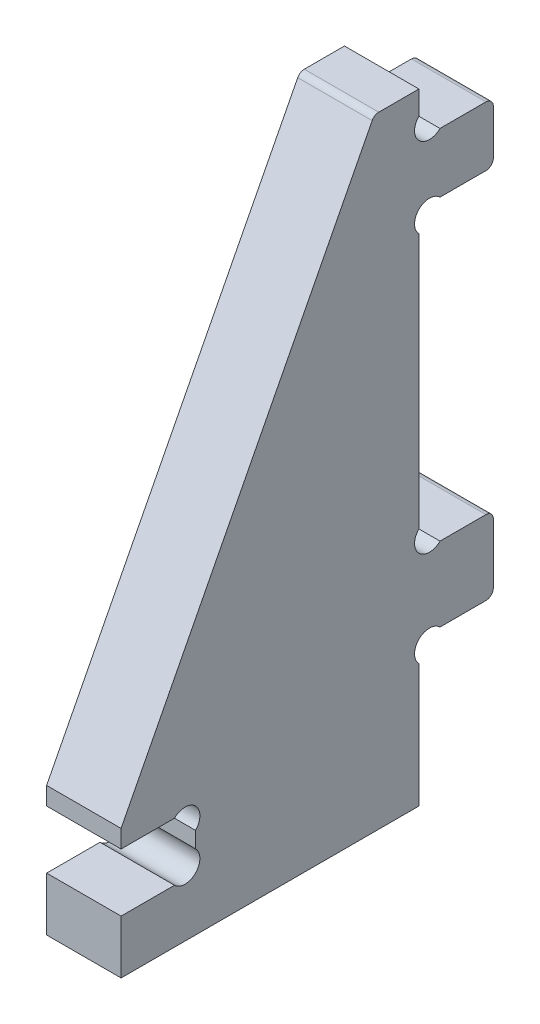
ISO-10303-21;
HEADER;
FILE_DESCRIPTION(('STEP AP214'),'2;1');
FILE_NAME('part.step','',(''),(''),'','','');
FILE_SCHEMA(('AUTOMOTIVE_DESIGN { 1 0 10303 214 1 1 1 1 }'));
ENDSEC;
DATA;
#1=APPLICATION_CONTEXT('core data for automotive mechanical design processes');
#2=APPLICATION_PROTOCOL_DEFINITION('international standard','automotive_design',2000,#1);
#3=PRODUCT_CONTEXT('',#1,'mechanical');
#4=PRODUCT('Part','Part','',(#3));
#5=PRODUCT_RELATED_PRODUCT_CATEGORY('part','',(#4));
#6=PRODUCT_DEFINITION_FORMATION('','',#4);
#7=PRODUCT_DEFINITION_CONTEXT('part definition',#1,'design');
#8=PRODUCT_DEFINITION('design','',#6,#7);
#9=PRODUCT_DEFINITION_SHAPE('','',#8);
#10=(LENGTH_UNIT() NAMED_UNIT(*) SI_UNIT(.MILLI.,.METRE.));
#11=(NAMED_UNIT(*) PLANE_ANGLE_UNIT() SI_UNIT($,.RADIAN.));
#12=(NAMED_UNIT(*) SI_UNIT($,.STERADIAN.) SOLID_ANGLE_UNIT());
#13=UNCERTAINTY_MEASURE_WITH_UNIT(LENGTH_MEASURE(1.E-05),#10,'distance_accuracy_value','');
#14=(GEOMETRIC_REPRESENTATION_CONTEXT(3) GLOBAL_UNCERTAINTY_ASSIGNED_CONTEXT((#13)) GLOBAL_UNIT_ASSIGNED_CONTEXT((#10,
#11,#12)) REPRESENTATION_CONTEXT('',''));
#15=CARTESIAN_POINT('',(0.,0.,0.));
#16=DIRECTION('',(0.,0.,1.));
#17=DIRECTION('',(1.,0.,0.));
#18=AXIS2_PLACEMENT_3D('',#15,#16,#17);
#19=CARTESIAN_POINT('',(5.,45.,-20.));
#20=DIRECTION('',(0.,0.,1.));
#21=DIRECTION('',(0.,-1.,0.));
#22=AXIS2_PLACEMENT_3D('',#19,#20,#21);
#23=PLANE('',#22);
#24=DIRECTION('',(0.,1.,0.));
#25=VECTOR('',#24,1.);
#26=CARTESIAN_POINT('',(0.,45.,-20.));
#27=LINE('',#26,#25);
#28=CARTESIAN_POINT('',(0.,19.4142135623731,-20.));
#29=VERTEX_POINT('',#28);
#30=CARTESIAN_POINT('',(0.,36.585786437627,-20.));
#31=VERTEX_POINT('',#30);
#32=EDGE_CURVE('E281',#29,#31,#27,.T.);
#33=ORIENTED_EDGE('',*,*,#32,.T.);
#34=DIRECTION('',(1.,0.,0.));
#35=VECTOR('',#34,1.);
#36=CARTESIAN_POINT('',(0.,36.585786437627,-20.));
#37=LINE('',#36,#35);
#38=CARTESIAN_POINT('',(5.,36.585786437627,-20.));
#39=VERTEX_POINT('',#38);
#40=EDGE_CURVE('E474',#31,#39,#37,.T.);
#41=ORIENTED_EDGE('',*,*,#40,.T.);
#42=DIRECTION('',(0.,1.,0.));
#43=VECTOR('',#42,1.);
#44=CARTESIAN_POINT('',(5.,45.,-20.));
#45=LINE('',#44,#43);
#46=CARTESIAN_POINT('',(5.,19.4142135623731,-20.));
#47=VERTEX_POINT('',#46);
#48=EDGE_CURVE('E245',#47,#39,#45,.T.);
#49=ORIENTED_EDGE('',*,*,#48,.F.);
#50=DIRECTION('',(1.,0.,0.));
#51=VECTOR('',#50,1.);
#52=CARTESIAN_POINT('',(0.,19.4142135623731,-20.));
#53=LINE('',#52,#51);
#54=EDGE_CURVE('E383',#47,#29,#53,.F.);
#55=ORIENTED_EDGE('',*,*,#54,.T.);
#56=EDGE_LOOP('',(#33,#41,#49,#55));
#57=FACE_BOUND('',#56,.T.);
#58=ADVANCED_FACE('F34',(#57),#23,.F.);
#59=CARTESIAN_POINT('',(5.,43.4142135623731,-20.));
#60=VERTEX_POINT('',#59);
#61=CARTESIAN_POINT('',(5.,45.,-20.));
#62=VERTEX_POINT('',#61);
#63=EDGE_CURVE('E236',#60,#62,#45,.T.);
#64=ORIENTED_EDGE('',*,*,#63,.F.);
#65=DIRECTION('',(1.,0.,0.));
#66=VECTOR('',#65,1.);
#67=CARTESIAN_POINT('',(0.,43.4142135623731,-20.));
#68=LINE('',#67,#66);
#69=CARTESIAN_POINT('',(0.,43.4142135623731,-20.));
#70=VERTEX_POINT('',#69);
#71=EDGE_CURVE('E221',#60,#70,#68,.F.);
#72=ORIENTED_EDGE('',*,*,#71,.T.);
#73=CARTESIAN_POINT('',(0.,45.,-20.));
#74=VERTEX_POINT('',#73);
#75=EDGE_CURVE('E257',#70,#74,#27,.T.);
#76=ORIENTED_EDGE('',*,*,#75,.T.);
#77=DIRECTION('',(-1.,0.,0.));
#78=VECTOR('',#77,1.);
#79=CARTESIAN_POINT('',(5.,45.,-20.));
#80=LINE('',#79,#78);
#81=EDGE_CURVE('E243',#62,#74,#80,.T.);
#82=ORIENTED_EDGE('',*,*,#81,.F.);
#83=EDGE_LOOP('',(#64,#72,#76,#82));
#84=FACE_BOUND('',#83,.T.);
#85=ADVANCED_FACE('F241',(#84),#23,.F.);
#86=CARTESIAN_POINT('',(0.,3.3,-20.));
#87=VERTEX_POINT('',#86);
#88=CARTESIAN_POINT('',(0.,11.5857864376269,-20.));
#89=VERTEX_POINT('',#88);
#90=EDGE_CURVE('E277',#87,#89,#27,.T.);
#91=ORIENTED_EDGE('',*,*,#90,.T.);
#92=DIRECTION('',(1.,0.,0.));
#93=VECTOR('',#92,1.);
#94=CARTESIAN_POINT('',(0.,11.5857864376269,-20.));
#95=LINE('',#94,#93);
#96=CARTESIAN_POINT('',(5.,11.5857864376269,-20.));
#97=VERTEX_POINT('',#96);
#98=EDGE_CURVE('E526',#89,#97,#95,.T.);
#99=ORIENTED_EDGE('',*,*,#98,.T.);
#100=CARTESIAN_POINT('',(5.,3.3,-20.));
#101=VERTEX_POINT('',#100);
#102=EDGE_CURVE('E249',#101,#97,#45,.T.);
#103=ORIENTED_EDGE('',*,*,#102,.F.);
#104=DIRECTION('',(1.,0.,0.));
#105=VECTOR('',#104,1.);
#106=CARTESIAN_POINT('',(0.,3.3,-20.));
#107=LINE('',#106,#105);
#108=EDGE_CURVE('E423',#87,#101,#107,.T.);
#109=ORIENTED_EDGE('',*,*,#108,.F.);
#110=EDGE_LOOP('',(#91,#99,#103,#109));
#111=FACE_BOUND('',#110,.T.);
#112=ADVANCED_FACE('F524',(#111),#23,.F.);
#113=CARTESIAN_POINT('',(5.,45.,-17.));
#114=DIRECTION('',(0.,-1.,0.));
#115=DIRECTION('',(0.,0.,-1.));
#116=AXIS2_PLACEMENT_3D('',#113,#114,#115);
#117=PLANE('',#116);
#118=DIRECTION('',(0.,0.,1.));
#119=VECTOR('',#118,1.);
#120=CARTESIAN_POINT('',(0.,45.,-17.));
#121=LINE('',#120,#119);
#122=CARTESIAN_POINT('',(0.,45.,-17.3048700361597));
#123=VERTEX_POINT('',#122);
#124=EDGE_CURVE('E280',#74,#123,#121,.T.);
#125=ORIENTED_EDGE('',*,*,#124,.T.);
#126=DIRECTION('',(-1.,0.,0.));
#127=VECTOR('',#126,1.);
#128=CARTESIAN_POINT('',(5.,45.,-17.3048700361597));
#129=LINE('',#128,#127);
#130=CARTESIAN_POINT('',(5.,45.,-17.3048700361597));
#131=VERTEX_POINT('',#130);
#132=EDGE_CURVE('E326',#123,#131,#129,.F.);
#133=ORIENTED_EDGE('',*,*,#132,.T.);
#134=DIRECTION('',(0.,0.,1.));
#135=VECTOR('',#134,1.);
#136=CARTESIAN_POINT('',(5.,45.,-17.));
#137=LINE('',#136,#135);
#138=EDGE_CURVE('E267',#62,#131,#137,.T.);
#139=ORIENTED_EDGE('',*,*,#138,.F.);
#140=ORIENTED_EDGE('',*,*,#81,.T.);
#141=EDGE_LOOP('',(#125,#133,#139,#140));
#142=FACE_BOUND('',#141,.T.);
#143=ADVANCED_FACE('F491',(#142),#117,.F.);
#144=CARTESIAN_POINT('',(5.,12.,0.));
#145=DIRECTION('',(0.,-0.45795658967431,-0.888974556426603));
#146=DIRECTION('',(0.,0.888974556426603,-0.45795658967431));
#147=AXIS2_PLACEMENT_3D('',#144,#145,#146);
#148=PLANE('',#147);
#149=DIRECTION('',(0.,-0.888974556426603,0.45795658967431));
#150=VECTOR('',#149,1.);
#151=CARTESIAN_POINT('',(5.,12.,0.));
#152=LINE('',#151,#150);
#153=CARTESIAN_POINT('',(5.,44.7289782948371,-16.8603827579464));
#154=VERTEX_POINT('',#153);
#155=CARTESIAN_POINT('',(5.,12.,0.));
#156=VERTEX_POINT('',#155);
#157=EDGE_CURVE('E446',#154,#156,#152,.T.);
#158=ORIENTED_EDGE('',*,*,#157,.F.);
#159=DIRECTION('',(-1.,0.,0.));
#160=VECTOR('',#159,1.);
#161=CARTESIAN_POINT('',(5.,44.7289782948371,-16.8603827579464));
#162=LINE('',#161,#160);
#163=CARTESIAN_POINT('',(0.,44.7289782948371,-16.8603827579464));
#164=VERTEX_POINT('',#163);
#165=EDGE_CURVE('E260',#154,#164,#162,.T.);
#166=ORIENTED_EDGE('',*,*,#165,.T.);
#167=DIRECTION('',(0.,-0.888974556426603,0.45795658967431));
#168=VECTOR('',#167,1.);
#169=CARTESIAN_POINT('',(0.,12.,0.));
#170=LINE('',#169,#168);
#171=CARTESIAN_POINT('',(0.,12.,0.));
#172=VERTEX_POINT('',#171);
#173=EDGE_CURVE('E252',#164,#172,#170,.T.);
#174=ORIENTED_EDGE('',*,*,#173,.T.);
#175=DIRECTION('',(-1.,0.,0.));
#176=VECTOR('',#175,1.);
#177=CARTESIAN_POINT('',(5.,12.,0.));
#178=LINE('',#177,#176);
#179=EDGE_CURVE('E448',#156,#172,#178,.T.);
#180=ORIENTED_EDGE('',*,*,#179,.F.);
#181=EDGE_LOOP('',(#158,#166,#174,#180));
#182=FACE_BOUND('',#181,.T.);
#183=ADVANCED_FACE('F495',(#182),#148,.F.);
#184=CARTESIAN_POINT('',(5.,0.,0.));
#185=DIRECTION('',(0.,0.,-1.));
#186=DIRECTION('',(-1.,0.,0.));
#187=AXIS2_PLACEMENT_3D('',#184,#185,#186);
#188=PLANE('',#187);
#189=DIRECTION('',(0.,-1.,0.));
#190=VECTOR('',#189,1.);
#191=CARTESIAN_POINT('',(0.,0.,0.));
#192=LINE('',#191,#190);
#193=CARTESIAN_POINT('',(0.,10.8,0.));
#194=VERTEX_POINT('',#193);
#195=EDGE_CURVE('E246',#172,#194,#192,.T.);
#196=ORIENTED_EDGE('',*,*,#195,.T.);
#197=DIRECTION('',(1.,0.,0.));
#198=VECTOR('',#197,1.);
#199=CARTESIAN_POINT('',(0.,10.8,0.));
#200=LINE('',#199,#198);
#201=CARTESIAN_POINT('',(5.,10.8,0.));
#202=VERTEX_POINT('',#201);
#203=EDGE_CURVE('E265',#194,#202,#200,.T.);
#204=ORIENTED_EDGE('',*,*,#203,.T.);
#205=DIRECTION('',(0.,-1.,0.));
#206=VECTOR('',#205,1.);
#207=CARTESIAN_POINT('',(5.,0.,0.));
#208=LINE('',#207,#206);
#209=EDGE_CURVE('E287',#156,#202,#208,.T.);
#210=ORIENTED_EDGE('',*,*,#209,.F.);
#211=ORIENTED_EDGE('',*,*,#179,.T.);
#212=EDGE_LOOP('',(#196,#204,#210,#211));
#213=FACE_BOUND('',#212,.T.);
#214=ADVANCED_FACE('F442',(#213),#188,.F.);
#215=CARTESIAN_POINT('',(5.,0.,0.));
#216=DIRECTION('',(-1.,0.,0.));
#217=DIRECTION('',(0.,0.,1.));
#218=AXIS2_PLACEMENT_3D('',#215,#216,#217);
#219=PLANE('',#218);
#220=ORIENTED_EDGE('',*,*,#138,.T.);
#221=CARTESIAN_POINT('',(5.,44.5,-17.3048700361597));
#222=DIRECTION('',(-1.,0.,0.));
#223=DIRECTION('',(0.,0.,1.));
#224=AXIS2_PLACEMENT_3D('',#221,#222,#223);
#225=CIRCLE('',#224,0.5);
#226=EDGE_CURVE('E335',#131,#154,#225,.F.);
#227=ORIENTED_EDGE('',*,*,#226,.T.);
#228=ORIENTED_EDGE('',*,*,#157,.T.);
#229=ORIENTED_EDGE('',*,*,#209,.T.);
#230=DIRECTION('',(0.,0.,1.));
#231=VECTOR('',#230,1.);
#232=CARTESIAN_POINT('',(5.,10.8,0.));
#233=LINE('',#232,#231);
#234=CARTESIAN_POINT('',(5.,10.8,-3.58578643762691));
#235=VERTEX_POINT('',#234);
#236=EDGE_CURVE('E430',#235,#202,#233,.T.);
#237=ORIENTED_EDGE('',*,*,#236,.F.);
#238=CARTESIAN_POINT('',(5.,10.0928932188134,-4.29289321881346));
#239=DIRECTION('',(1.,0.,0.));
#240=DIRECTION('',(0.,0.,-1.));
#241=AXIS2_PLACEMENT_3D('',#238,#239,#240);
#242=CIRCLE('',#241,1.);
#243=CARTESIAN_POINT('',(5.,9.38578643762689,-5.));
#244=VERTEX_POINT('',#243);
#245=EDGE_CURVE('E396',#244,#235,#242,.T.);
#246=ORIENTED_EDGE('',*,*,#245,.F.);
#247=DIRECTION('',(0.,1.,0.));
#248=VECTOR('',#247,1.);
#249=CARTESIAN_POINT('',(5.,0.,-5.));
#250=LINE('',#249,#248);
#251=CARTESIAN_POINT('',(5.,8.31421356237309,-5.));
#252=VERTEX_POINT('',#251);
#253=EDGE_CURVE('E426',#252,#244,#250,.T.);
#254=ORIENTED_EDGE('',*,*,#253,.F.);
#255=CARTESIAN_POINT('',(5.,7.60710678118655,-4.29289321881345));
#256=DIRECTION('',(1.,0.,0.));
#257=DIRECTION('',(0.,0.,-1.));
#258=AXIS2_PLACEMENT_3D('',#255,#256,#257);
#259=CIRCLE('',#258,1.);
#260=CARTESIAN_POINT('',(5.,6.9,-3.58578643762691));
#261=VERTEX_POINT('',#260);
#262=EDGE_CURVE('E315',#261,#252,#259,.T.);
#263=ORIENTED_EDGE('',*,*,#262,.F.);
#264=DIRECTION('',(0.,0.,1.));
#265=VECTOR('',#264,1.);
#266=CARTESIAN_POINT('',(5.,6.9,-5.));
#267=LINE('',#266,#265);
#268=CARTESIAN_POINT('',(5.,6.9,0.));
#269=VERTEX_POINT('',#268);
#270=EDGE_CURVE('E404',#261,#269,#267,.T.);
#271=ORIENTED_EDGE('',*,*,#270,.T.);
#272=DIRECTION('',(0.,-1.,0.));
#273=VECTOR('',#272,1.);
#274=CARTESIAN_POINT('',(5.,3.3,0.));
#275=LINE('',#274,#273);
#276=CARTESIAN_POINT('',(5.,3.3,0.));
#277=VERTEX_POINT('',#276);
#278=EDGE_CURVE('E408',#269,#277,#275,.T.);
#279=ORIENTED_EDGE('',*,*,#278,.T.);
#280=DIRECTION('',(0.,0.,1.));
#281=VECTOR('',#280,1.);
#282=CARTESIAN_POINT('',(5.,3.3,-20.));
#283=LINE('',#282,#281);
#284=EDGE_CURVE('E418',#101,#277,#283,.T.);
#285=ORIENTED_EDGE('',*,*,#284,.F.);
#286=ORIENTED_EDGE('',*,*,#102,.T.);
#287=CARTESIAN_POINT('',(5.,12.2928932188135,-20.7071067811865));
#288=DIRECTION('',(1.,0.,0.));
#289=DIRECTION('',(0.,0.,-1.));
#290=AXIS2_PLACEMENT_3D('',#287,#288,#289);
#291=CIRCLE('',#290,1.);
#292=CARTESIAN_POINT('',(5.,13.,-21.4142135623731));
#293=VERTEX_POINT('',#292);
#294=EDGE_CURVE('E534',#293,#97,#291,.T.);
#295=ORIENTED_EDGE('',*,*,#294,.F.);
#296=DIRECTION('',(0.,0.,-1.));
#297=VECTOR('',#296,1.);
#298=CARTESIAN_POINT('',(5.,13.,-20.));
#299=LINE('',#298,#297);
#300=CARTESIAN_POINT('',(5.,13.,-24.5));
#301=VERTEX_POINT('',#300);
#302=EDGE_CURVE('E379',#293,#301,#299,.T.);
#303=ORIENTED_EDGE('',*,*,#302,.T.);
#304=CARTESIAN_POINT('',(5.,13.5,-24.5));
#305=DIRECTION('',(-1.,0.,0.));
#306=DIRECTION('',(0.,0.,1.));
#307=AXIS2_PLACEMENT_3D('',#304,#305,#306);
#308=CIRCLE('',#307,0.5);
#309=CARTESIAN_POINT('',(5.,13.5,-25.));
#310=VERTEX_POINT('',#309);
#311=EDGE_CURVE('E328',#301,#310,#308,.F.);
#312=ORIENTED_EDGE('',*,*,#311,.T.);
#313=DIRECTION('',(0.,1.,0.));
#314=VECTOR('',#313,1.);
#315=CARTESIAN_POINT('',(5.,13.,-25.));
#316=LINE('',#315,#314);
#317=CARTESIAN_POINT('',(5.,17.5,-25.));
#318=VERTEX_POINT('',#317);
#319=EDGE_CURVE('E376',#310,#318,#316,.T.);
#320=ORIENTED_EDGE('',*,*,#319,.T.);
#321=CARTESIAN_POINT('',(5.,17.5,-24.5));
#322=DIRECTION('',(-1.,0.,0.));
#323=DIRECTION('',(0.,0.,1.));
#324=AXIS2_PLACEMENT_3D('',#321,#322,#323);
#325=CIRCLE('',#324,0.5);
#326=CARTESIAN_POINT('',(5.,18.,-24.5));
#327=VERTEX_POINT('',#326);
#328=EDGE_CURVE('E331',#318,#327,#325,.F.);
#329=ORIENTED_EDGE('',*,*,#328,.T.);
#330=DIRECTION('',(0.,0.,1.));
#331=VECTOR('',#330,1.);
#332=CARTESIAN_POINT('',(5.,18.,-20.));
#333=LINE('',#332,#331);
#334=CARTESIAN_POINT('',(5.,18.,-21.4142135623731));
#335=VERTEX_POINT('',#334);
#336=EDGE_CURVE('E357',#327,#335,#333,.T.);
#337=ORIENTED_EDGE('',*,*,#336,.T.);
#338=CARTESIAN_POINT('',(5.,18.7071067811865,-20.7071067811866));
#339=DIRECTION('',(1.,0.,0.));
#340=DIRECTION('',(0.,0.,-1.));
#341=AXIS2_PLACEMENT_3D('',#338,#339,#340);
#342=CIRCLE('',#341,1.);
#343=EDGE_CURVE('E529',#47,#335,#342,.T.);
#344=ORIENTED_EDGE('',*,*,#343,.F.);
#345=ORIENTED_EDGE('',*,*,#48,.T.);
#346=CARTESIAN_POINT('',(5.,37.2928932188134,-20.7071067811866));
#347=DIRECTION('',(1.,0.,0.));
#348=DIRECTION('',(0.,0.,-1.));
#349=AXIS2_PLACEMENT_3D('',#346,#347,#348);
#350=CIRCLE('',#349,0.999999999999962);
#351=CARTESIAN_POINT('',(5.,38.,-21.4142135623731));
#352=VERTEX_POINT('',#351);
#353=EDGE_CURVE('E232',#352,#39,#350,.T.);
#354=ORIENTED_EDGE('',*,*,#353,.F.);
#355=DIRECTION('',(0.,0.,-1.));
#356=VECTOR('',#355,1.);
#357=CARTESIAN_POINT('',(5.,38.,-20.));
#358=LINE('',#357,#356);
#359=CARTESIAN_POINT('',(5.,38.,-24.5));
#360=VERTEX_POINT('',#359);
#361=EDGE_CURVE('E301',#352,#360,#358,.T.);
#362=ORIENTED_EDGE('',*,*,#361,.T.);
#363=CARTESIAN_POINT('',(5.,38.5,-24.5));
#364=DIRECTION('',(-1.,0.,0.));
#365=DIRECTION('',(0.,0.,1.));
#366=AXIS2_PLACEMENT_3D('',#363,#364,#365);
#367=CIRCLE('',#366,0.5);
#368=CARTESIAN_POINT('',(5.,38.5,-25.));
#369=VERTEX_POINT('',#368);
#370=EDGE_CURVE('E57',#360,#369,#367,.F.);
#371=ORIENTED_EDGE('',*,*,#370,.T.);
#372=DIRECTION('',(0.,1.,0.));
#373=VECTOR('',#372,1.);
#374=CARTESIAN_POINT('',(5.,38.,-25.));
#375=LINE('',#374,#373);
#376=CARTESIAN_POINT('',(5.,41.5,-25.));
#377=VERTEX_POINT('',#376);
#378=EDGE_CURVE('E303',#369,#377,#375,.T.);
#379=ORIENTED_EDGE('',*,*,#378,.T.);
#380=CARTESIAN_POINT('',(5.,41.5,-24.5));
#381=DIRECTION('',(-1.,0.,0.));
#382=DIRECTION('',(0.,0.,1.));
#383=AXIS2_PLACEMENT_3D('',#380,#381,#382);
#384=CIRCLE('',#383,0.5);
#385=CARTESIAN_POINT('',(5.,42.,-24.5));
#386=VERTEX_POINT('',#385);
#387=EDGE_CURVE('E49',#377,#386,#384,.F.);
#388=ORIENTED_EDGE('',*,*,#387,.T.);
#389=DIRECTION('',(0.,0.,1.));
#390=VECTOR('',#389,1.);
#391=CARTESIAN_POINT('',(5.,42.,-20.));
#392=LINE('',#391,#390);
#393=CARTESIAN_POINT('',(5.,42.,-21.4142135623731));
#394=VERTEX_POINT('',#393);
#395=EDGE_CURVE('E239',#386,#394,#392,.T.);
#396=ORIENTED_EDGE('',*,*,#395,.T.);
#397=CARTESIAN_POINT('',(5.,42.7071067811865,-20.7071067811865));
#398=DIRECTION('',(1.,0.,0.));
#399=DIRECTION('',(0.,0.,-1.));
#400=AXIS2_PLACEMENT_3D('',#397,#398,#399);
#401=CIRCLE('',#400,0.999999999999995);
#402=EDGE_CURVE('E225',#60,#394,#401,.T.);
#403=ORIENTED_EDGE('',*,*,#402,.F.);
#404=ORIENTED_EDGE('',*,*,#63,.T.);
#405=EDGE_LOOP('',(#220,#227,#228,#229,#237,#246,#254,#263,#271,#279,#285,#286,#295,#303,#312,
#320,#329,#337,#344,#345,#354,#362,#371,#379,#388,#396,#403,#404));
#406=FACE_BOUND('',#405,.T.);
#407=ADVANCED_FACE('F235',(#406),#219,.F.);
#408=CARTESIAN_POINT('',(0.,0.,0.));
#409=DIRECTION('',(-1.,0.,0.));
#410=DIRECTION('',(0.,0.,1.));
#411=AXIS2_PLACEMENT_3D('',#408,#409,#410);
#412=PLANE('',#411);
#413=ORIENTED_EDGE('',*,*,#173,.F.);
#414=CARTESIAN_POINT('',(0.,44.5,-17.3048700361597));
#415=DIRECTION('',(-1.,0.,0.));
#416=DIRECTION('',(0.,0.,1.));
#417=AXIS2_PLACEMENT_3D('',#414,#415,#416);
#418=CIRCLE('',#417,0.5);
#419=EDGE_CURVE('E324',#164,#123,#418,.T.);
#420=ORIENTED_EDGE('',*,*,#419,.T.);
#421=ORIENTED_EDGE('',*,*,#124,.F.);
#422=ORIENTED_EDGE('',*,*,#75,.F.);
#423=CARTESIAN_POINT('',(0.,42.7071067811865,-20.7071067811865));
#424=DIRECTION('',(1.,0.,0.));
#425=DIRECTION('',(0.,0.,-1.));
#426=AXIS2_PLACEMENT_3D('',#423,#424,#425);
#427=CIRCLE('',#426,0.999999999999995);
#428=CARTESIAN_POINT('',(0.,42.,-21.4142135623731));
#429=VERTEX_POINT('',#428);
#430=EDGE_CURVE('E228',#70,#429,#427,.T.);
#431=ORIENTED_EDGE('',*,*,#430,.T.);
#432=DIRECTION('',(0.,0.,1.));
#433=VECTOR('',#432,1.);
#434=CARTESIAN_POINT('',(0.,42.,-20.));
#435=LINE('',#434,#433);
#436=CARTESIAN_POINT('',(0.,42.,-24.5));
#437=VERTEX_POINT('',#436);
#438=EDGE_CURVE('E313',#437,#429,#435,.T.);
#439=ORIENTED_EDGE('',*,*,#438,.F.);
#440=CARTESIAN_POINT('',(0.,41.5,-24.5));
#441=DIRECTION('',(-1.,0.,0.));
#442=DIRECTION('',(0.,0.,1.));
#443=AXIS2_PLACEMENT_3D('',#440,#441,#442);
#444=CIRCLE('',#443,0.5);
#445=CARTESIAN_POINT('',(0.,41.5,-25.));
#446=VERTEX_POINT('',#445);
#447=EDGE_CURVE('E320',#437,#446,#444,.T.);
#448=ORIENTED_EDGE('',*,*,#447,.T.);
#449=DIRECTION('',(0.,1.,0.));
#450=VECTOR('',#449,1.);
#451=CARTESIAN_POINT('',(0.,38.,-25.));
#452=LINE('',#451,#450);
#453=CARTESIAN_POINT('',(0.,38.5,-25.));
#454=VERTEX_POINT('',#453);
#455=EDGE_CURVE('E308',#454,#446,#452,.T.);
#456=ORIENTED_EDGE('',*,*,#455,.F.);
#457=CARTESIAN_POINT('',(0.,38.5,-24.5));
#458=DIRECTION('',(-1.,0.,0.));
#459=DIRECTION('',(0.,0.,1.));
#460=AXIS2_PLACEMENT_3D('',#457,#458,#459);
#461=CIRCLE('',#460,0.5);
#462=CARTESIAN_POINT('',(0.,38.,-24.5));
#463=VERTEX_POINT('',#462);
#464=EDGE_CURVE('E322',#454,#463,#461,.T.);
#465=ORIENTED_EDGE('',*,*,#464,.T.);
#466=DIRECTION('',(0.,0.,-1.));
#467=VECTOR('',#466,1.);
#468=CARTESIAN_POINT('',(0.,38.,-20.));
#469=LINE('',#468,#467);
#470=CARTESIAN_POINT('',(0.,38.,-21.4142135623731));
#471=VERTEX_POINT('',#470);
#472=EDGE_CURVE('E305',#471,#463,#469,.T.);
#473=ORIENTED_EDGE('',*,*,#472,.F.);
#474=CARTESIAN_POINT('',(0.,37.2928932188134,-20.7071067811866));
#475=DIRECTION('',(1.,0.,0.));
#476=DIRECTION('',(0.,0.,-1.));
#477=AXIS2_PLACEMENT_3D('',#474,#475,#476);
#478=CIRCLE('',#477,0.999999999999962);
#479=EDGE_CURVE('E466',#471,#31,#478,.T.);
#480=ORIENTED_EDGE('',*,*,#479,.T.);
#481=ORIENTED_EDGE('',*,*,#32,.F.);
#482=CARTESIAN_POINT('',(0.,18.7071067811865,-20.7071067811866));
#483=DIRECTION('',(1.,0.,0.));
#484=DIRECTION('',(0.,0.,-1.));
#485=AXIS2_PLACEMENT_3D('',#482,#483,#484);
#486=CIRCLE('',#485,1.);
#487=CARTESIAN_POINT('',(0.,18.,-21.4142135623731));
#488=VERTEX_POINT('',#487);
#489=EDGE_CURVE('E366',#29,#488,#486,.T.);
#490=ORIENTED_EDGE('',*,*,#489,.T.);
#491=DIRECTION('',(0.,0.,1.));
#492=VECTOR('',#491,1.);
#493=CARTESIAN_POINT('',(0.,18.,-20.));
#494=LINE('',#493,#492);
#495=CARTESIAN_POINT('',(0.,18.,-24.5));
#496=VERTEX_POINT('',#495);
#497=EDGE_CURVE('E304',#496,#488,#494,.T.);
#498=ORIENTED_EDGE('',*,*,#497,.F.);
#499=CARTESIAN_POINT('',(0.,17.5,-24.5));
#500=DIRECTION('',(-1.,0.,0.));
#501=DIRECTION('',(0.,0.,1.));
#502=AXIS2_PLACEMENT_3D('',#499,#500,#501);
#503=CIRCLE('',#502,0.5);
#504=CARTESIAN_POINT('',(0.,17.5,-25.));
#505=VERTEX_POINT('',#504);
#506=EDGE_CURVE('E318',#496,#505,#503,.T.);
#507=ORIENTED_EDGE('',*,*,#506,.T.);
#508=DIRECTION('',(0.,1.,0.));
#509=VECTOR('',#508,1.);
#510=CARTESIAN_POINT('',(0.,13.,-25.));
#511=LINE('',#510,#509);
#512=CARTESIAN_POINT('',(0.,13.5,-25.));
#513=VERTEX_POINT('',#512);
#514=EDGE_CURVE('E368',#513,#505,#511,.T.);
#515=ORIENTED_EDGE('',*,*,#514,.F.);
#516=CARTESIAN_POINT('',(0.,13.5,-24.5));
#517=DIRECTION('',(-1.,0.,0.));
#518=DIRECTION('',(0.,0.,1.));
#519=AXIS2_PLACEMENT_3D('',#516,#517,#518);
#520=CIRCLE('',#519,0.5);
#521=CARTESIAN_POINT('',(0.,13.,-24.5));
#522=VERTEX_POINT('',#521);
#523=EDGE_CURVE('E316',#513,#522,#520,.T.);
#524=ORIENTED_EDGE('',*,*,#523,.T.);
#525=DIRECTION('',(0.,0.,-1.));
#526=VECTOR('',#525,1.);
#527=CARTESIAN_POINT('',(0.,13.,-20.));
#528=LINE('',#527,#526);
#529=CARTESIAN_POINT('',(0.,13.,-21.4142135623731));
#530=VERTEX_POINT('',#529);
#531=EDGE_CURVE('E381',#530,#522,#528,.T.);
#532=ORIENTED_EDGE('',*,*,#531,.F.);
#533=CARTESIAN_POINT('',(0.,12.2928932188135,-20.7071067811865));
#534=DIRECTION('',(1.,0.,0.));
#535=DIRECTION('',(0.,0.,-1.));
#536=AXIS2_PLACEMENT_3D('',#533,#534,#535);
#537=CIRCLE('',#536,1.);
#538=EDGE_CURVE('E530',#530,#89,#537,.T.);
#539=ORIENTED_EDGE('',*,*,#538,.T.);
#540=ORIENTED_EDGE('',*,*,#90,.F.);
#541=DIRECTION('',(0.,0.,1.));
#542=VECTOR('',#541,1.);
#543=CARTESIAN_POINT('',(0.,3.3,-20.));
#544=LINE('',#543,#542);
#545=CARTESIAN_POINT('',(0.,3.3,0.));
#546=VERTEX_POINT('',#545);
#547=EDGE_CURVE('E421',#87,#546,#544,.T.);
#548=ORIENTED_EDGE('',*,*,#547,.T.);
#549=DIRECTION('',(0.,-1.,0.));
#550=VECTOR('',#549,1.);
#551=CARTESIAN_POINT('',(0.,3.3,0.));
#552=LINE('',#551,#550);
#553=CARTESIAN_POINT('',(0.,6.9,0.));
#554=VERTEX_POINT('',#553);
#555=EDGE_CURVE('E407',#554,#546,#552,.T.);
#556=ORIENTED_EDGE('',*,*,#555,.F.);
#557=DIRECTION('',(0.,0.,1.));
#558=VECTOR('',#557,1.);
#559=CARTESIAN_POINT('',(0.,6.9,-5.));
#560=LINE('',#559,#558);
#561=CARTESIAN_POINT('',(0.,6.9,-3.58578643762691));
#562=VERTEX_POINT('',#561);
#563=EDGE_CURVE('E405',#562,#554,#560,.T.);
#564=ORIENTED_EDGE('',*,*,#563,.F.);
#565=CARTESIAN_POINT('',(0.,7.60710678118655,-4.29289321881345));
#566=DIRECTION('',(1.,0.,0.));
#567=DIRECTION('',(0.,0.,-1.));
#568=AXIS2_PLACEMENT_3D('',#565,#566,#567);
#569=CIRCLE('',#568,1.);
#570=CARTESIAN_POINT('',(0.,8.31421356237309,-5.));
#571=VERTEX_POINT('',#570);
#572=EDGE_CURVE('E389',#562,#571,#569,.T.);
#573=ORIENTED_EDGE('',*,*,#572,.T.);
#574=DIRECTION('',(0.,1.,0.));
#575=VECTOR('',#574,1.);
#576=CARTESIAN_POINT('',(0.,0.,-5.));
#577=LINE('',#576,#575);
#578=CARTESIAN_POINT('',(0.,9.38578643762689,-5.));
#579=VERTEX_POINT('',#578);
#580=EDGE_CURVE('E427',#571,#579,#577,.T.);
#581=ORIENTED_EDGE('',*,*,#580,.T.);
#582=CARTESIAN_POINT('',(0.,10.0928932188134,-4.29289321881346));
#583=DIRECTION('',(1.,0.,0.));
#584=DIRECTION('',(0.,0.,-1.));
#585=AXIS2_PLACEMENT_3D('',#582,#583,#584);
#586=CIRCLE('',#585,1.);
#587=CARTESIAN_POINT('',(0.,10.8,-3.58578643762691));
#588=VERTEX_POINT('',#587);
#589=EDGE_CURVE('E397',#579,#588,#586,.T.);
#590=ORIENTED_EDGE('',*,*,#589,.T.);
#591=DIRECTION('',(0.,0.,1.));
#592=VECTOR('',#591,1.);
#593=CARTESIAN_POINT('',(0.,10.8,0.));
#594=LINE('',#593,#592);
#595=EDGE_CURVE('E429',#588,#194,#594,.T.);
#596=ORIENTED_EDGE('',*,*,#595,.T.);
#597=ORIENTED_EDGE('',*,*,#195,.F.);
#598=EDGE_LOOP('',(#413,#420,#421,#422,#431,#439,#448,#456,#465,#473,#480,#481,#490,#498,#507,
#515,#524,#532,#539,#540,#548,#556,#564,#573,#581,#590,#596,#597));
#599=FACE_BOUND('',#598,.T.);
#600=ADVANCED_FACE('F362',(#599),#412,.T.);
#601=CARTESIAN_POINT('',(0.,10.8,0.));
#602=DIRECTION('',(0.,1.,0.));
#603=DIRECTION('',(0.,0.,1.));
#604=AXIS2_PLACEMENT_3D('',#601,#602,#603);
#605=PLANE('',#604);
#606=ORIENTED_EDGE('',*,*,#595,.F.);
#607=DIRECTION('',(1.,0.,0.));
#608=VECTOR('',#607,1.);
#609=CARTESIAN_POINT('',(0.,10.8,-3.58578643762691));
#610=LINE('',#609,#608);
#611=EDGE_CURVE('E400',#588,#235,#610,.T.);
#612=ORIENTED_EDGE('',*,*,#611,.T.);
#613=ORIENTED_EDGE('',*,*,#236,.T.);
#614=ORIENTED_EDGE('',*,*,#203,.F.);
#615=EDGE_LOOP('',(#606,#612,#613,#614));
#616=FACE_BOUND('',#615,.T.);
#617=ADVANCED_FACE('F437',(#616),#605,.F.);
#618=CARTESIAN_POINT('',(0.,0.,-5.));
#619=DIRECTION('',(0.,0.,-1.));
#620=DIRECTION('',(0.,1.,0.));
#621=AXIS2_PLACEMENT_3D('',#618,#619,#620);
#622=PLANE('',#621);
#623=ORIENTED_EDGE('',*,*,#580,.F.);
#624=DIRECTION('',(1.,0.,0.));
#625=VECTOR('',#624,1.);
#626=CARTESIAN_POINT('',(0.,8.31421356237309,-5.));
#627=LINE('',#626,#625);
#628=EDGE_CURVE('E392',#571,#252,#627,.T.);
#629=ORIENTED_EDGE('',*,*,#628,.T.);
#630=ORIENTED_EDGE('',*,*,#253,.T.);
#631=DIRECTION('',(1.,0.,0.));
#632=VECTOR('',#631,1.);
#633=CARTESIAN_POINT('',(0.,9.38578643762689,-5.));
#634=LINE('',#633,#632);
#635=EDGE_CURVE('E492',#244,#579,#634,.F.);
#636=ORIENTED_EDGE('',*,*,#635,.T.);
#637=EDGE_LOOP('',(#623,#629,#630,#636));
#638=FACE_BOUND('',#637,.T.);
#639=ADVANCED_FACE('F502',(#638),#622,.F.);
#640=CARTESIAN_POINT('',(0.,3.3,-20.));
#641=DIRECTION('',(0.,1.,0.));
#642=DIRECTION('',(0.,0.,1.));
#643=AXIS2_PLACEMENT_3D('',#640,#641,#642);
#644=PLANE('',#643);
#645=ORIENTED_EDGE('',*,*,#284,.T.);
#646=DIRECTION('',(1.,0.,0.));
#647=VECTOR('',#646,1.);
#648=CARTESIAN_POINT('',(0.,3.3,0.));
#649=LINE('',#648,#647);
#650=EDGE_CURVE('E415',#546,#277,#649,.T.);
#651=ORIENTED_EDGE('',*,*,#650,.F.);
#652=ORIENTED_EDGE('',*,*,#547,.F.);
#653=ORIENTED_EDGE('',*,*,#108,.T.);
#654=EDGE_LOOP('',(#645,#651,#652,#653));
#655=FACE_BOUND('',#654,.T.);
#656=ADVANCED_FACE('F580',(#655),#644,.F.);
#657=CARTESIAN_POINT('',(0.,3.3,0.));
#658=DIRECTION('',(0.,0.,1.));
#659=DIRECTION('',(1.,0.,0.));
#660=AXIS2_PLACEMENT_3D('',#657,#658,#659);
#661=PLANE('',#660);
#662=ORIENTED_EDGE('',*,*,#278,.F.);
#663=DIRECTION('',(1.,0.,0.));
#664=VECTOR('',#663,1.);
#665=CARTESIAN_POINT('',(0.,6.9,0.));
#666=LINE('',#665,#664);
#667=EDGE_CURVE('E411',#554,#269,#666,.T.);
#668=ORIENTED_EDGE('',*,*,#667,.F.);
#669=ORIENTED_EDGE('',*,*,#555,.T.);
#670=ORIENTED_EDGE('',*,*,#650,.T.);
#671=EDGE_LOOP('',(#662,#668,#669,#670));
#672=FACE_BOUND('',#671,.T.);
#673=ADVANCED_FACE('F516',(#672),#661,.T.);
#674=CARTESIAN_POINT('',(0.,6.9,-5.));
#675=DIRECTION('',(0.,1.,0.));
#676=DIRECTION('',(0.,0.,1.));
#677=AXIS2_PLACEMENT_3D('',#674,#675,#676);
#678=PLANE('',#677);
#679=DIRECTION('',(1.,0.,0.));
#680=VECTOR('',#679,1.);
#681=CARTESIAN_POINT('',(0.,6.9,-3.58578643762691));
#682=LINE('',#681,#680);
#683=EDGE_CURVE('E275',#562,#261,#682,.T.);
#684=ORIENTED_EDGE('',*,*,#683,.F.);
#685=ORIENTED_EDGE('',*,*,#563,.T.);
#686=ORIENTED_EDGE('',*,*,#667,.T.);
#687=ORIENTED_EDGE('',*,*,#270,.F.);
#688=EDGE_LOOP('',(#684,#685,#686,#687));
#689=FACE_BOUND('',#688,.T.);
#690=ADVANCED_FACE('F511',(#689),#678,.T.);
#691=CARTESIAN_POINT('',(0.,10.0928932188134,-4.29289321881346));
#692=DIRECTION('',(1.,0.,0.));
#693=DIRECTION('',(0.,0.,-1.));
#694=AXIS2_PLACEMENT_3D('',#691,#692,#693);
#695=CYLINDRICAL_SURFACE('',#694,1.);
#696=ORIENTED_EDGE('',*,*,#589,.F.);
#697=ORIENTED_EDGE('',*,*,#635,.F.);
#698=ORIENTED_EDGE('',*,*,#245,.T.);
#699=ORIENTED_EDGE('',*,*,#611,.F.);
#700=EDGE_LOOP('',(#696,#697,#698,#699));
#701=FACE_BOUND('',#700,.T.);
#702=ADVANCED_FACE('F500',(#701),#695,.F.);
#703=CARTESIAN_POINT('',(0.,7.60710678118655,-4.29289321881345));
#704=DIRECTION('',(1.,0.,0.));
#705=DIRECTION('',(0.,0.,-1.));
#706=AXIS2_PLACEMENT_3D('',#703,#704,#705);
#707=CYLINDRICAL_SURFACE('',#706,1.);
#708=ORIENTED_EDGE('',*,*,#572,.F.);
#709=ORIENTED_EDGE('',*,*,#683,.T.);
#710=ORIENTED_EDGE('',*,*,#262,.T.);
#711=ORIENTED_EDGE('',*,*,#628,.F.);
#712=EDGE_LOOP('',(#708,#709,#710,#711));
#713=FACE_BOUND('',#712,.T.);
#714=ADVANCED_FACE('F508',(#713),#707,.F.);
#715=CARTESIAN_POINT('',(0.,42.,-20.));
#716=DIRECTION('',(0.,1.,0.));
#717=DIRECTION('',(0.,0.,1.));
#718=AXIS2_PLACEMENT_3D('',#715,#716,#717);
#719=PLANE('',#718);
#720=ORIENTED_EDGE('',*,*,#395,.F.);
#721=DIRECTION('',(1.,0.,0.));
#722=VECTOR('',#721,1.);
#723=CARTESIAN_POINT('',(0.,42.,-24.5));
#724=LINE('',#723,#722);
#725=EDGE_CURVE('E344',#386,#437,#724,.F.);
#726=ORIENTED_EDGE('',*,*,#725,.T.);
#727=ORIENTED_EDGE('',*,*,#438,.T.);
#728=DIRECTION('',(1.,0.,0.));
#729=VECTOR('',#728,1.);
#730=CARTESIAN_POINT('',(0.,42.,-21.4142135623731));
#731=LINE('',#730,#729);
#732=EDGE_CURVE('E458',#394,#429,#731,.F.);
#733=ORIENTED_EDGE('',*,*,#732,.F.);
#734=EDGE_LOOP('',(#720,#726,#727,#733));
#735=FACE_BOUND('',#734,.T.);
#736=ADVANCED_FACE('F593',(#735),#719,.T.);
#737=CARTESIAN_POINT('',(0.,38.,-25.));
#738=DIRECTION('',(0.,0.,-1.));
#739=DIRECTION('',(-1.,0.,0.));
#740=AXIS2_PLACEMENT_3D('',#737,#738,#739);
#741=PLANE('',#740);
#742=ORIENTED_EDGE('',*,*,#378,.F.);
#743=DIRECTION('',(1.,0.,0.));
#744=VECTOR('',#743,1.);
#745=CARTESIAN_POINT('',(0.,38.5,-25.));
#746=LINE('',#745,#744);
#747=EDGE_CURVE('E342',#369,#454,#746,.F.);
#748=ORIENTED_EDGE('',*,*,#747,.T.);
#749=ORIENTED_EDGE('',*,*,#455,.T.);
#750=DIRECTION('',(1.,0.,0.));
#751=VECTOR('',#750,1.);
#752=CARTESIAN_POINT('',(0.,41.5,-25.));
#753=LINE('',#752,#751);
#754=EDGE_CURVE('E340',#446,#377,#753,.T.);
#755=ORIENTED_EDGE('',*,*,#754,.T.);
#756=EDGE_LOOP('',(#742,#748,#749,#755));
#757=FACE_BOUND('',#756,.T.);
#758=ADVANCED_FACE('F596',(#757),#741,.T.);
#759=CARTESIAN_POINT('',(0.,38.,-20.));
#760=DIRECTION('',(0.,-1.,0.));
#761=DIRECTION('',(0.,0.,-1.));
#762=AXIS2_PLACEMENT_3D('',#759,#760,#761);
#763=PLANE('',#762);
#764=ORIENTED_EDGE('',*,*,#472,.T.);
#765=DIRECTION('',(1.,0.,0.));
#766=VECTOR('',#765,1.);
#767=CARTESIAN_POINT('',(0.,38.,-24.5));
#768=LINE('',#767,#766);
#769=EDGE_CURVE('E337',#463,#360,#768,.T.);
#770=ORIENTED_EDGE('',*,*,#769,.T.);
#771=ORIENTED_EDGE('',*,*,#361,.F.);
#772=DIRECTION('',(1.,0.,0.));
#773=VECTOR('',#772,1.);
#774=CARTESIAN_POINT('',(0.,38.,-21.4142135623731));
#775=LINE('',#774,#773);
#776=EDGE_CURVE('E300',#471,#352,#775,.T.);
#777=ORIENTED_EDGE('',*,*,#776,.F.);
#778=EDGE_LOOP('',(#764,#770,#771,#777));
#779=FACE_BOUND('',#778,.T.);
#780=ADVANCED_FACE('F469',(#779),#763,.T.);
#781=CARTESIAN_POINT('',(0.,18.,-20.));
#782=DIRECTION('',(0.,1.,0.));
#783=DIRECTION('',(0.,0.,1.));
#784=AXIS2_PLACEMENT_3D('',#781,#782,#783);
#785=PLANE('',#784);
#786=ORIENTED_EDGE('',*,*,#336,.F.);
#787=DIRECTION('',(1.,0.,0.));
#788=VECTOR('',#787,1.);
#789=CARTESIAN_POINT('',(0.,18.,-24.5));
#790=LINE('',#789,#788);
#791=EDGE_CURVE('E42',#327,#496,#790,.F.);
#792=ORIENTED_EDGE('',*,*,#791,.T.);
#793=ORIENTED_EDGE('',*,*,#497,.T.);
#794=DIRECTION('',(1.,0.,0.));
#795=VECTOR('',#794,1.);
#796=CARTESIAN_POINT('',(0.,18.,-21.4142135623731));
#797=LINE('',#796,#795);
#798=EDGE_CURVE('E294',#335,#488,#797,.F.);
#799=ORIENTED_EDGE('',*,*,#798,.F.);
#800=EDGE_LOOP('',(#786,#792,#793,#799));
#801=FACE_BOUND('',#800,.T.);
#802=ADVANCED_FACE('F354',(#801),#785,.T.);
#803=CARTESIAN_POINT('',(0.,13.,-25.));
#804=DIRECTION('',(0.,0.,-1.));
#805=DIRECTION('',(-1.,0.,0.));
#806=AXIS2_PLACEMENT_3D('',#803,#804,#805);
#807=PLANE('',#806);
#808=ORIENTED_EDGE('',*,*,#514,.T.);
#809=DIRECTION('',(1.,0.,0.));
#810=VECTOR('',#809,1.);
#811=CARTESIAN_POINT('',(0.,17.5,-25.));
#812=LINE('',#811,#810);
#813=EDGE_CURVE('E348',#505,#318,#812,.T.);
#814=ORIENTED_EDGE('',*,*,#813,.T.);
#815=ORIENTED_EDGE('',*,*,#319,.F.);
#816=DIRECTION('',(1.,0.,0.));
#817=VECTOR('',#816,1.);
#818=CARTESIAN_POINT('',(0.,13.5,-25.));
#819=LINE('',#818,#817);
#820=EDGE_CURVE('E346',#310,#513,#819,.F.);
#821=ORIENTED_EDGE('',*,*,#820,.T.);
#822=EDGE_LOOP('',(#808,#814,#815,#821));
#823=FACE_BOUND('',#822,.T.);
#824=ADVANCED_FACE('F375',(#823),#807,.T.);
#825=CARTESIAN_POINT('',(0.,13.,-20.));
#826=DIRECTION('',(0.,-1.,0.));
#827=DIRECTION('',(0.,0.,-1.));
#828=AXIS2_PLACEMENT_3D('',#825,#826,#827);
#829=PLANE('',#828);
#830=ORIENTED_EDGE('',*,*,#531,.T.);
#831=DIRECTION('',(1.,0.,0.));
#832=VECTOR('',#831,1.);
#833=CARTESIAN_POINT('',(0.,13.,-24.5));
#834=LINE('',#833,#832);
#835=EDGE_CURVE('E11',#522,#301,#834,.T.);
#836=ORIENTED_EDGE('',*,*,#835,.T.);
#837=ORIENTED_EDGE('',*,*,#302,.F.);
#838=DIRECTION('',(1.,0.,0.));
#839=VECTOR('',#838,1.);
#840=CARTESIAN_POINT('',(0.,13.,-21.4142135623731));
#841=LINE('',#840,#839);
#842=EDGE_CURVE('E297',#530,#293,#841,.T.);
#843=ORIENTED_EDGE('',*,*,#842,.F.);
#844=EDGE_LOOP('',(#830,#836,#837,#843));
#845=FACE_BOUND('',#844,.T.);
#846=ADVANCED_FACE('F546',(#845),#829,.T.);
#847=CARTESIAN_POINT('',(0.,18.7071067811865,-20.7071067811866));
#848=DIRECTION('',(1.,0.,0.));
#849=DIRECTION('',(0.,0.,-1.));
#850=AXIS2_PLACEMENT_3D('',#847,#848,#849);
#851=CYLINDRICAL_SURFACE('',#850,1.);
#852=ORIENTED_EDGE('',*,*,#343,.T.);
#853=ORIENTED_EDGE('',*,*,#798,.T.);
#854=ORIENTED_EDGE('',*,*,#489,.F.);
#855=ORIENTED_EDGE('',*,*,#54,.F.);
#856=EDGE_LOOP('',(#852,#853,#854,#855));
#857=FACE_BOUND('',#856,.T.);
#858=ADVANCED_FACE('F605',(#857),#851,.F.);
#859=CARTESIAN_POINT('',(0.,12.2928932188135,-20.7071067811865));
#860=DIRECTION('',(1.,0.,0.));
#861=DIRECTION('',(0.,0.,-1.));
#862=AXIS2_PLACEMENT_3D('',#859,#860,#861);
#863=CYLINDRICAL_SURFACE('',#862,1.);
#864=ORIENTED_EDGE('',*,*,#538,.F.);
#865=ORIENTED_EDGE('',*,*,#842,.T.);
#866=ORIENTED_EDGE('',*,*,#294,.T.);
#867=ORIENTED_EDGE('',*,*,#98,.F.);
#868=EDGE_LOOP('',(#864,#865,#866,#867));
#869=FACE_BOUND('',#868,.T.);
#870=ADVANCED_FACE('F612',(#869),#863,.F.);
#871=CARTESIAN_POINT('',(0.,37.2928932188134,-20.7071067811866));
#872=DIRECTION('',(1.,0.,0.));
#873=DIRECTION('',(0.,0.,-1.));
#874=AXIS2_PLACEMENT_3D('',#871,#872,#873);
#875=CYLINDRICAL_SURFACE('',#874,0.999999999999962);
#876=ORIENTED_EDGE('',*,*,#479,.F.);
#877=ORIENTED_EDGE('',*,*,#776,.T.);
#878=ORIENTED_EDGE('',*,*,#353,.T.);
#879=ORIENTED_EDGE('',*,*,#40,.F.);
#880=EDGE_LOOP('',(#876,#877,#878,#879));
#881=FACE_BOUND('',#880,.T.);
#882=ADVANCED_FACE('F463',(#881),#875,.F.);
#883=CARTESIAN_POINT('',(0.,42.7071067811865,-20.7071067811865));
#884=DIRECTION('',(1.,0.,0.));
#885=DIRECTION('',(0.,0.,-1.));
#886=AXIS2_PLACEMENT_3D('',#883,#884,#885);
#887=CYLINDRICAL_SURFACE('',#886,0.999999999999995);
#888=ORIENTED_EDGE('',*,*,#402,.T.);
#889=ORIENTED_EDGE('',*,*,#732,.T.);
#890=ORIENTED_EDGE('',*,*,#430,.F.);
#891=ORIENTED_EDGE('',*,*,#71,.F.);
#892=EDGE_LOOP('',(#888,#889,#890,#891));
#893=FACE_BOUND('',#892,.T.);
#894=ADVANCED_FACE('F223',(#893),#887,.F.);
#895=CARTESIAN_POINT('',(5.,44.5,-17.3048700361597));
#896=DIRECTION('',(-1.,0.,0.));
#897=DIRECTION('',(0.,0.,1.));
#898=AXIS2_PLACEMENT_3D('',#895,#896,#897);
#899=CYLINDRICAL_SURFACE('',#898,0.5);
#900=ORIENTED_EDGE('',*,*,#226,.F.);
#901=ORIENTED_EDGE('',*,*,#132,.F.);
#902=ORIENTED_EDGE('',*,*,#419,.F.);
#903=ORIENTED_EDGE('',*,*,#165,.F.);
#904=EDGE_LOOP('',(#900,#901,#902,#903));
#905=FACE_BOUND('',#904,.T.);
#906=ADVANCED_FACE('F455',(#905),#899,.T.);
#907=CARTESIAN_POINT('',(0.,38.5,-24.5));
#908=DIRECTION('',(1.,0.,0.));
#909=DIRECTION('',(0.,0.,-1.));
#910=AXIS2_PLACEMENT_3D('',#907,#908,#909);
#911=CYLINDRICAL_SURFACE('',#910,0.5);
#912=ORIENTED_EDGE('',*,*,#464,.F.);
#913=ORIENTED_EDGE('',*,*,#747,.F.);
#914=ORIENTED_EDGE('',*,*,#370,.F.);
#915=ORIENTED_EDGE('',*,*,#769,.F.);
#916=EDGE_LOOP('',(#912,#913,#914,#915));
#917=FACE_BOUND('',#916,.T.);
#918=ADVANCED_FACE('F622',(#917),#911,.T.);
#919=CARTESIAN_POINT('',(0.,41.5,-24.5));
#920=DIRECTION('',(1.,0.,0.));
#921=DIRECTION('',(0.,0.,-1.));
#922=AXIS2_PLACEMENT_3D('',#919,#920,#921);
#923=CYLINDRICAL_SURFACE('',#922,0.5);
#924=ORIENTED_EDGE('',*,*,#447,.F.);
#925=ORIENTED_EDGE('',*,*,#725,.F.);
#926=ORIENTED_EDGE('',*,*,#387,.F.);
#927=ORIENTED_EDGE('',*,*,#754,.F.);
#928=EDGE_LOOP('',(#924,#925,#926,#927));
#929=FACE_BOUND('',#928,.T.);
#930=ADVANCED_FACE('F554',(#929),#923,.T.);
#931=CARTESIAN_POINT('',(0.,17.5,-24.5));
#932=DIRECTION('',(1.,0.,0.));
#933=DIRECTION('',(0.,0.,-1.));
#934=AXIS2_PLACEMENT_3D('',#931,#932,#933);
#935=CYLINDRICAL_SURFACE('',#934,0.5);
#936=ORIENTED_EDGE('',*,*,#506,.F.);
#937=ORIENTED_EDGE('',*,*,#791,.F.);
#938=ORIENTED_EDGE('',*,*,#328,.F.);
#939=ORIENTED_EDGE('',*,*,#813,.F.);
#940=EDGE_LOOP('',(#936,#937,#938,#939));
#941=FACE_BOUND('',#940,.T.);
#942=ADVANCED_FACE('F371',(#941),#935,.T.);
#943=CARTESIAN_POINT('',(0.,13.5,-24.5));
#944=DIRECTION('',(1.,0.,0.));
#945=DIRECTION('',(0.,0.,-1.));
#946=AXIS2_PLACEMENT_3D('',#943,#944,#945);
#947=CYLINDRICAL_SURFACE('',#946,0.5);
#948=ORIENTED_EDGE('',*,*,#523,.F.);
#949=ORIENTED_EDGE('',*,*,#820,.F.);
#950=ORIENTED_EDGE('',*,*,#311,.F.);
#951=ORIENTED_EDGE('',*,*,#835,.F.);
#952=EDGE_LOOP('',(#948,#949,#950,#951));
#953=FACE_BOUND('',#952,.T.);
#954=ADVANCED_FACE('F36',(#953),#947,.T.);
#955=CLOSED_SHELL('',(#58,#85,#112,#143,#183,#214,#407,#600,#617,#639,#656,#673,#690,#702,#714,
#736,#758,#780,#802,#824,#846,#858,#870,#882,#894,#906,#918,#930,#942,#954));
#956=MANIFOLD_SOLID_BREP('B2',#955);
#957=ADVANCED_BREP_SHAPE_REPRESENTATION('',(#18,#956),#14);
#958=SHAPE_DEFINITION_REPRESENTATION(#9,#957);
ENDSEC;
END-ISO-10303-21;
